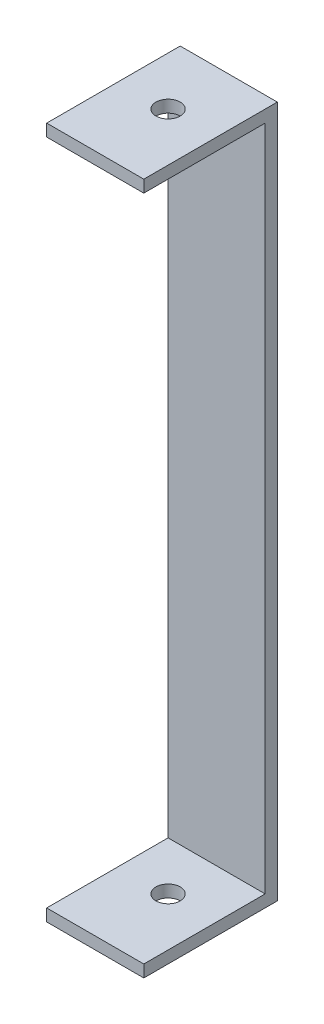
ISO-10303-21;
HEADER;
FILE_DESCRIPTION(('STEP AP214'),'2;1');
FILE_NAME('part.step','',(''),(''),'','','');
FILE_SCHEMA(('AUTOMOTIVE_DESIGN { 1 0 10303 214 1 1 1 1 }'));
ENDSEC;
DATA;
#1=APPLICATION_CONTEXT('core data for automotive mechanical design processes');
#2=APPLICATION_PROTOCOL_DEFINITION('international standard','automotive_design',2000,#1);
#3=PRODUCT_CONTEXT('',#1,'mechanical');
#4=PRODUCT('Part','Part','',(#3));
#5=PRODUCT_RELATED_PRODUCT_CATEGORY('part','',(#4));
#6=PRODUCT_DEFINITION_FORMATION('','',#4);
#7=PRODUCT_DEFINITION_CONTEXT('part definition',#1,'design');
#8=PRODUCT_DEFINITION('design','',#6,#7);
#9=PRODUCT_DEFINITION_SHAPE('','',#8);
#10=(LENGTH_UNIT() NAMED_UNIT(*) SI_UNIT(.MILLI.,.METRE.));
#11=(NAMED_UNIT(*) PLANE_ANGLE_UNIT() SI_UNIT($,.RADIAN.));
#12=(NAMED_UNIT(*) SI_UNIT($,.STERADIAN.) SOLID_ANGLE_UNIT());
#13=UNCERTAINTY_MEASURE_WITH_UNIT(LENGTH_MEASURE(1.E-05),#10,'distance_accuracy_value','');
#14=(GEOMETRIC_REPRESENTATION_CONTEXT(3) GLOBAL_UNCERTAINTY_ASSIGNED_CONTEXT((#13)) GLOBAL_UNIT_ASSIGNED_CONTEXT((#10,
#11,#12)) REPRESENTATION_CONTEXT('',''));
#15=CARTESIAN_POINT('',(0.,0.,0.));
#16=DIRECTION('',(0.,0.,1.));
#17=DIRECTION('',(1.,0.,0.));
#18=AXIS2_PLACEMENT_3D('',#15,#16,#17);
#19=CARTESIAN_POINT('',(0.,0.,2.));
#20=DIRECTION('',(0.,0.,-1.));
#21=DIRECTION('',(-1.,0.,0.));
#22=AXIS2_PLACEMENT_3D('',#19,#20,#21);
#23=PLANE('',#22);
#24=DIRECTION('',(-1.,0.,0.));
#25=VECTOR('',#24,1.);
#26=CARTESIAN_POINT('',(16.3404255319149,2.17021276595745,2.));
#27=LINE('',#26,#25);
#28=CARTESIAN_POINT('',(16.3404255319149,2.17021276595745,2.));
#29=VERTEX_POINT('',#28);
#30=CARTESIAN_POINT('',(0.340425531914913,2.17021276595744,2.));
#31=VERTEX_POINT('',#30);
#32=EDGE_CURVE('E117',#29,#31,#27,.T.);
#33=ORIENTED_EDGE('',*,*,#32,.F.);
#34=DIRECTION('',(0.,1.,0.));
#35=VECTOR('',#34,1.);
#36=CARTESIAN_POINT('',(16.3404255319149,0.170212765957445,2.));
#37=LINE('',#36,#35);
#38=CARTESIAN_POINT('',(16.3404255319149,112.170212765957,2.));
#39=VERTEX_POINT('',#38);
#40=EDGE_CURVE('E121',#29,#39,#37,.T.);
#41=ORIENTED_EDGE('',*,*,#40,.T.);
#42=DIRECTION('',(1.,0.,0.));
#43=VECTOR('',#42,1.);
#44=CARTESIAN_POINT('',(16.3404255319149,112.170212765957,2.));
#45=LINE('',#44,#43);
#46=CARTESIAN_POINT('',(0.340425531914913,112.170212765957,2.));
#47=VERTEX_POINT('',#46);
#48=EDGE_CURVE('E53',#47,#39,#45,.T.);
#49=ORIENTED_EDGE('',*,*,#48,.F.);
#50=DIRECTION('',(0.,-1.,0.));
#51=VECTOR('',#50,1.);
#52=CARTESIAN_POINT('',(0.340425531914913,0.170212765957445,2.));
#53=LINE('',#52,#51);
#54=EDGE_CURVE('E48',#47,#31,#53,.T.);
#55=ORIENTED_EDGE('',*,*,#54,.T.);
#56=EDGE_LOOP('',(#33,#41,#49,#55));
#57=FACE_BOUND('',#56,.T.);
#58=ADVANCED_FACE('F32',(#57),#23,.F.);
#59=CARTESIAN_POINT('',(0.340425531914913,0.170212765957445,2.));
#60=DIRECTION('',(1.,0.,0.));
#61=DIRECTION('',(0.,0.,-1.));
#62=AXIS2_PLACEMENT_3D('',#59,#60,#61);
#63=PLANE('',#62);
#64=DIRECTION('',(0.,-1.,0.));
#65=VECTOR('',#64,1.);
#66=CARTESIAN_POINT('',(0.340425531914913,0.170212765957445,0.));
#67=LINE('',#66,#65);
#68=CARTESIAN_POINT('',(0.340425531914913,114.170212765957,0.));
#69=VERTEX_POINT('',#68);
#70=CARTESIAN_POINT('',(0.340425531914913,0.170212765957445,0.));
#71=VERTEX_POINT('',#70);
#72=EDGE_CURVE('E142',#69,#71,#67,.T.);
#73=ORIENTED_EDGE('',*,*,#72,.T.);
#74=DIRECTION('',(0.,0.,-1.));
#75=VECTOR('',#74,1.);
#76=CARTESIAN_POINT('',(0.340425531914913,0.170212765957445,2.));
#77=LINE('',#76,#75);
#78=CARTESIAN_POINT('',(0.340425531914913,0.170212765957443,22.));
#79=VERTEX_POINT('',#78);
#80=EDGE_CURVE('E11',#79,#71,#77,.T.);
#81=ORIENTED_EDGE('',*,*,#80,.F.);
#82=DIRECTION('',(0.,-1.,0.));
#83=VECTOR('',#82,1.);
#84=CARTESIAN_POINT('',(0.340425531914913,2.17021276595744,22.));
#85=LINE('',#84,#83);
#86=CARTESIAN_POINT('',(0.340425531914913,2.17021276595744,22.));
#87=VERTEX_POINT('',#86);
#88=EDGE_CURVE('E107',#87,#79,#85,.T.);
#89=ORIENTED_EDGE('',*,*,#88,.F.);
#90=DIRECTION('',(0.,0.,-1.));
#91=VECTOR('',#90,1.);
#92=CARTESIAN_POINT('',(0.340425531914913,2.17021276595744,22.));
#93=LINE('',#92,#91);
#94=EDGE_CURVE('E103',#87,#31,#93,.T.);
#95=ORIENTED_EDGE('',*,*,#94,.T.);
#96=ORIENTED_EDGE('',*,*,#54,.F.);
#97=DIRECTION('',(0.,0.,-1.));
#98=VECTOR('',#97,1.);
#99=CARTESIAN_POINT('',(0.340425531914913,112.170212765957,22.));
#100=LINE('',#99,#98);
#101=CARTESIAN_POINT('',(0.340425531914913,112.170212765957,22.));
#102=VERTEX_POINT('',#101);
#103=EDGE_CURVE('E139',#102,#47,#100,.T.);
#104=ORIENTED_EDGE('',*,*,#103,.F.);
#105=DIRECTION('',(0.,-1.,0.));
#106=VECTOR('',#105,1.);
#107=CARTESIAN_POINT('',(0.340425531914913,114.170212765957,22.));
#108=LINE('',#107,#106);
#109=CARTESIAN_POINT('',(0.340425531914913,114.170212765957,22.));
#110=VERTEX_POINT('',#109);
#111=EDGE_CURVE('E133',#110,#102,#108,.T.);
#112=ORIENTED_EDGE('',*,*,#111,.F.);
#113=DIRECTION('',(0.,0.,-1.));
#114=VECTOR('',#113,1.);
#115=CARTESIAN_POINT('',(0.340425531914913,114.170212765957,2.));
#116=LINE('',#115,#114);
#117=EDGE_CURVE('E146',#110,#69,#116,.T.);
#118=ORIENTED_EDGE('',*,*,#117,.T.);
#119=EDGE_LOOP('',(#73,#81,#89,#95,#96,#104,#112,#118));
#120=FACE_BOUND('',#119,.T.);
#121=ADVANCED_FACE('F34',(#120),#63,.F.);
#122=CARTESIAN_POINT('',(0.340425531914913,0.170212765957445,2.));
#123=DIRECTION('',(0.,1.,0.));
#124=DIRECTION('',(0.,0.,1.));
#125=AXIS2_PLACEMENT_3D('',#122,#123,#124);
#126=PLANE('',#125);
#127=CARTESIAN_POINT('',(8.34042553191491,0.170212765957439,10.));
#128=DIRECTION('',(0.,1.,0.));
#129=DIRECTION('',(0.,0.,1.));
#130=AXIS2_PLACEMENT_3D('',#127,#128,#129);
#131=CIRCLE('',#130,2.);
#132=CARTESIAN_POINT('',(8.34042553191491,0.170212765957439,12.));
#133=VERTEX_POINT('',#132);
#134=EDGE_CURVE('E205',#133,#133,#131,.T.);
#135=ORIENTED_EDGE('',*,*,#134,.T.);
#136=EDGE_LOOP('',(#135));
#137=FACE_BOUND('',#136,.T.);
#138=DIRECTION('',(1.,0.,0.));
#139=VECTOR('',#138,1.);
#140=CARTESIAN_POINT('',(0.340425531914913,0.170212765957445,0.));
#141=LINE('',#140,#139);
#142=CARTESIAN_POINT('',(16.3404255319149,0.170212765957445,0.));
#143=VERTEX_POINT('',#142);
#144=EDGE_CURVE('E149',#71,#143,#141,.T.);
#145=ORIENTED_EDGE('',*,*,#144,.T.);
#146=DIRECTION('',(0.,0.,-1.));
#147=VECTOR('',#146,1.);
#148=CARTESIAN_POINT('',(16.3404255319149,0.170212765957445,2.));
#149=LINE('',#148,#147);
#150=CARTESIAN_POINT('',(16.3404255319149,0.170212765957445,22.));
#151=VERTEX_POINT('',#150);
#152=EDGE_CURVE('E41',#151,#143,#149,.T.);
#153=ORIENTED_EDGE('',*,*,#152,.F.);
#154=DIRECTION('',(1.,0.,0.));
#155=VECTOR('',#154,1.);
#156=CARTESIAN_POINT('',(16.3404255319149,0.170212765957445,22.));
#157=LINE('',#156,#155);
#158=EDGE_CURVE('E114',#79,#151,#157,.T.);
#159=ORIENTED_EDGE('',*,*,#158,.F.);
#160=ORIENTED_EDGE('',*,*,#80,.T.);
#161=EDGE_LOOP('',(#145,#153,#159,#160));
#162=FACE_BOUND('',#161,.T.);
#163=ADVANCED_FACE('F193',(#137,#162),#126,.F.);
#164=CARTESIAN_POINT('',(16.3404255319149,0.170212765957445,2.));
#165=DIRECTION('',(-1.,0.,0.));
#166=DIRECTION('',(0.,0.,1.));
#167=AXIS2_PLACEMENT_3D('',#164,#165,#166);
#168=PLANE('',#167);
#169=DIRECTION('',(0.,1.,0.));
#170=VECTOR('',#169,1.);
#171=CARTESIAN_POINT('',(16.3404255319149,0.170212765957445,0.));
#172=LINE('',#171,#170);
#173=CARTESIAN_POINT('',(16.3404255319149,114.170212765957,0.));
#174=VERTEX_POINT('',#173);
#175=EDGE_CURVE('E151',#143,#174,#172,.T.);
#176=ORIENTED_EDGE('',*,*,#175,.T.);
#177=DIRECTION('',(0.,0.,-1.));
#178=VECTOR('',#177,1.);
#179=CARTESIAN_POINT('',(16.3404255319149,114.170212765957,2.));
#180=LINE('',#179,#178);
#181=CARTESIAN_POINT('',(16.3404255319149,114.170212765957,22.));
#182=VERTEX_POINT('',#181);
#183=EDGE_CURVE('E156',#182,#174,#180,.T.);
#184=ORIENTED_EDGE('',*,*,#183,.F.);
#185=DIRECTION('',(0.,1.,0.));
#186=VECTOR('',#185,1.);
#187=CARTESIAN_POINT('',(16.3404255319149,114.170212765957,22.));
#188=LINE('',#187,#186);
#189=CARTESIAN_POINT('',(16.3404255319149,112.170212765957,22.));
#190=VERTEX_POINT('',#189);
#191=EDGE_CURVE('E123',#190,#182,#188,.T.);
#192=ORIENTED_EDGE('',*,*,#191,.F.);
#193=DIRECTION('',(0.,0.,-1.));
#194=VECTOR('',#193,1.);
#195=CARTESIAN_POINT('',(16.3404255319149,112.170212765957,22.));
#196=LINE('',#195,#194);
#197=EDGE_CURVE('E136',#190,#39,#196,.T.);
#198=ORIENTED_EDGE('',*,*,#197,.T.);
#199=ORIENTED_EDGE('',*,*,#40,.F.);
#200=DIRECTION('',(0.,0.,-1.));
#201=VECTOR('',#200,1.);
#202=CARTESIAN_POINT('',(16.3404255319149,2.17021276595745,22.));
#203=LINE('',#202,#201);
#204=CARTESIAN_POINT('',(16.3404255319149,2.17021276595745,22.));
#205=VERTEX_POINT('',#204);
#206=EDGE_CURVE('E101',#205,#29,#203,.T.);
#207=ORIENTED_EDGE('',*,*,#206,.F.);
#208=DIRECTION('',(0.,1.,0.));
#209=VECTOR('',#208,1.);
#210=CARTESIAN_POINT('',(16.3404255319149,2.17021276595745,22.));
#211=LINE('',#210,#209);
#212=EDGE_CURVE('E108',#151,#205,#211,.T.);
#213=ORIENTED_EDGE('',*,*,#212,.F.);
#214=ORIENTED_EDGE('',*,*,#152,.T.);
#215=EDGE_LOOP('',(#176,#184,#192,#198,#199,#207,#213,#214));
#216=FACE_BOUND('',#215,.T.);
#217=ADVANCED_FACE('F119',(#216),#168,.F.);
#218=CARTESIAN_POINT('',(0.340425531914913,114.170212765957,2.));
#219=DIRECTION('',(0.,-1.,0.));
#220=DIRECTION('',(0.,0.,-1.));
#221=AXIS2_PLACEMENT_3D('',#218,#219,#220);
#222=PLANE('',#221);
#223=CARTESIAN_POINT('',(8.34042553191491,114.170212765957,10.));
#224=DIRECTION('',(0.,1.,0.));
#225=DIRECTION('',(0.,0.,1.));
#226=AXIS2_PLACEMENT_3D('',#223,#224,#225);
#227=CIRCLE('',#226,2.);
#228=CARTESIAN_POINT('',(8.34042553191491,114.170212765957,12.));
#229=VERTEX_POINT('',#228);
#230=EDGE_CURVE('E213',#229,#229,#227,.T.);
#231=ORIENTED_EDGE('',*,*,#230,.F.);
#232=EDGE_LOOP('',(#231));
#233=FACE_BOUND('',#232,.T.);
#234=DIRECTION('',(-1.,0.,0.));
#235=VECTOR('',#234,1.);
#236=CARTESIAN_POINT('',(0.340425531914913,114.170212765957,0.));
#237=LINE('',#236,#235);
#238=EDGE_CURVE('E144',#174,#69,#237,.T.);
#239=ORIENTED_EDGE('',*,*,#238,.T.);
#240=ORIENTED_EDGE('',*,*,#117,.F.);
#241=DIRECTION('',(-1.,0.,0.));
#242=VECTOR('',#241,1.);
#243=CARTESIAN_POINT('',(16.3404255319149,114.170212765957,22.));
#244=LINE('',#243,#242);
#245=EDGE_CURVE('E130',#182,#110,#244,.T.);
#246=ORIENTED_EDGE('',*,*,#245,.F.);
#247=ORIENTED_EDGE('',*,*,#183,.T.);
#248=EDGE_LOOP('',(#239,#240,#246,#247));
#249=FACE_BOUND('',#248,.T.);
#250=ADVANCED_FACE('F166',(#233,#249),#222,.F.);
#251=CARTESIAN_POINT('',(0.,0.,0.));
#252=DIRECTION('',(0.,0.,-1.));
#253=DIRECTION('',(-1.,0.,0.));
#254=AXIS2_PLACEMENT_3D('',#251,#252,#253);
#255=PLANE('',#254);
#256=ORIENTED_EDGE('',*,*,#72,.F.);
#257=ORIENTED_EDGE('',*,*,#238,.F.);
#258=ORIENTED_EDGE('',*,*,#175,.F.);
#259=ORIENTED_EDGE('',*,*,#144,.F.);
#260=EDGE_LOOP('',(#256,#257,#258,#259));
#261=FACE_BOUND('',#260,.T.);
#262=ADVANCED_FACE('F164',(#261),#255,.T.);
#263=CARTESIAN_POINT('',(16.3404255319149,112.170212765957,22.));
#264=DIRECTION('',(0.,1.,0.));
#265=DIRECTION('',(0.,0.,1.));
#266=AXIS2_PLACEMENT_3D('',#263,#264,#265);
#267=PLANE('',#266);
#268=CARTESIAN_POINT('',(8.34042553191491,112.170212765957,10.));
#269=DIRECTION('',(0.,1.,0.));
#270=DIRECTION('',(0.,0.,1.));
#271=AXIS2_PLACEMENT_3D('',#268,#269,#270);
#272=CIRCLE('',#271,2.);
#273=CARTESIAN_POINT('',(8.34042553191491,112.170212765957,12.));
#274=VERTEX_POINT('',#273);
#275=EDGE_CURVE('E208',#274,#274,#272,.T.);
#276=ORIENTED_EDGE('',*,*,#275,.T.);
#277=EDGE_LOOP('',(#276));
#278=FACE_BOUND('',#277,.T.);
#279=ORIENTED_EDGE('',*,*,#48,.T.);
#280=ORIENTED_EDGE('',*,*,#197,.F.);
#281=DIRECTION('',(1.,0.,0.));
#282=VECTOR('',#281,1.);
#283=CARTESIAN_POINT('',(16.3404255319149,112.170212765957,22.));
#284=LINE('',#283,#282);
#285=EDGE_CURVE('E135',#102,#190,#284,.T.);
#286=ORIENTED_EDGE('',*,*,#285,.F.);
#287=ORIENTED_EDGE('',*,*,#103,.T.);
#288=EDGE_LOOP('',(#279,#280,#286,#287));
#289=FACE_BOUND('',#288,.T.);
#290=ADVANCED_FACE('F177',(#278,#289),#267,.F.);
#291=CARTESIAN_POINT('',(0.,0.,22.));
#292=DIRECTION('',(0.,0.,-1.));
#293=DIRECTION('',(-1.,0.,0.));
#294=AXIS2_PLACEMENT_3D('',#291,#292,#293);
#295=PLANE('',#294);
#296=ORIENTED_EDGE('',*,*,#191,.T.);
#297=ORIENTED_EDGE('',*,*,#245,.T.);
#298=ORIENTED_EDGE('',*,*,#111,.T.);
#299=ORIENTED_EDGE('',*,*,#285,.T.);
#300=EDGE_LOOP('',(#296,#297,#298,#299));
#301=FACE_BOUND('',#300,.T.);
#302=ADVANCED_FACE('F173',(#301),#295,.F.);
#303=CARTESIAN_POINT('',(16.3404255319149,2.17021276595745,22.));
#304=DIRECTION('',(0.,-1.,0.));
#305=DIRECTION('',(1.,0.,0.));
#306=AXIS2_PLACEMENT_3D('',#303,#304,#305);
#307=PLANE('',#306);
#308=CARTESIAN_POINT('',(8.34042553191491,2.17021276595744,10.));
#309=DIRECTION('',(0.,-1.,0.));
#310=DIRECTION('',(1.,0.,0.));
#311=AXIS2_PLACEMENT_3D('',#308,#309,#310);
#312=CIRCLE('',#311,2.);
#313=CARTESIAN_POINT('',(8.34042553191491,2.17021276595744,12.));
#314=VERTEX_POINT('',#313);
#315=EDGE_CURVE('E36',#314,#314,#312,.T.);
#316=ORIENTED_EDGE('',*,*,#315,.T.);
#317=EDGE_LOOP('',(#316));
#318=FACE_BOUND('',#317,.T.);
#319=ORIENTED_EDGE('',*,*,#32,.T.);
#320=ORIENTED_EDGE('',*,*,#94,.F.);
#321=DIRECTION('',(-1.,0.,0.));
#322=VECTOR('',#321,1.);
#323=CARTESIAN_POINT('',(16.3404255319149,2.17021276595745,22.));
#324=LINE('',#323,#322);
#325=EDGE_CURVE('E97',#205,#87,#324,.T.);
#326=ORIENTED_EDGE('',*,*,#325,.F.);
#327=ORIENTED_EDGE('',*,*,#206,.T.);
#328=EDGE_LOOP('',(#319,#320,#326,#327));
#329=FACE_BOUND('',#328,.T.);
#330=ADVANCED_FACE('F99',(#318,#329),#307,.F.);
#331=CARTESIAN_POINT('',(0.,0.,22.));
#332=DIRECTION('',(0.,0.,-1.));
#333=DIRECTION('',(-1.,0.,0.));
#334=AXIS2_PLACEMENT_3D('',#331,#332,#333);
#335=PLANE('',#334);
#336=ORIENTED_EDGE('',*,*,#212,.T.);
#337=ORIENTED_EDGE('',*,*,#325,.T.);
#338=ORIENTED_EDGE('',*,*,#88,.T.);
#339=ORIENTED_EDGE('',*,*,#158,.T.);
#340=EDGE_LOOP('',(#336,#337,#338,#339));
#341=FACE_BOUND('',#340,.T.);
#342=ADVANCED_FACE('F112',(#341),#335,.F.);
#343=CARTESIAN_POINT('',(8.34042553191491,0.170212765957439,10.));
#344=DIRECTION('',(0.,1.,0.));
#345=DIRECTION('',(0.,0.,1.));
#346=AXIS2_PLACEMENT_3D('',#343,#344,#345);
#347=CYLINDRICAL_SURFACE('',#346,2.);
#348=CARTESIAN_POINT('',(8.34042553191491,0.170212765957439,12.));
#349=CARTESIAN_POINT('',(8.34042553191491,0.191046099290773,12.));
#350=CARTESIAN_POINT('',(8.34042553191491,0.211879432624106,12.));
#351=CARTESIAN_POINT('',(8.34042553191491,0.253546099290773,12.));
#352=CARTESIAN_POINT('',(8.34042553191491,0.274379432624106,12.));
#353=CARTESIAN_POINT('',(8.34042553191491,0.316046099290773,12.));
#354=CARTESIAN_POINT('',(8.34042553191491,0.336879432624106,12.));
#355=CARTESIAN_POINT('',(8.34042553191491,0.378546099290773,12.));
#356=CARTESIAN_POINT('',(8.34042553191491,0.399379432624106,12.));
#357=CARTESIAN_POINT('',(8.34042553191491,0.441046099290773,12.));
#358=CARTESIAN_POINT('',(8.34042553191491,0.461879432624106,12.));
#359=CARTESIAN_POINT('',(8.34042553191491,0.503546099290773,12.));
#360=CARTESIAN_POINT('',(8.34042553191491,0.524379432624106,12.));
#361=CARTESIAN_POINT('',(8.34042553191491,0.566046099290773,12.));
#362=CARTESIAN_POINT('',(8.34042553191491,0.586879432624106,12.));
#363=CARTESIAN_POINT('',(8.34042553191491,0.628546099290773,12.));
#364=CARTESIAN_POINT('',(8.34042553191491,0.649379432624106,12.));
#365=CARTESIAN_POINT('',(8.34042553191491,0.691046099290773,12.));
#366=CARTESIAN_POINT('',(8.34042553191491,0.711879432624107,12.));
#367=CARTESIAN_POINT('',(8.34042553191491,0.753546099290773,12.));
#368=CARTESIAN_POINT('',(8.34042553191491,0.774379432624107,12.));
#369=CARTESIAN_POINT('',(8.34042553191491,0.816046099290773,12.));
#370=CARTESIAN_POINT('',(8.34042553191491,0.836879432624107,12.));
#371=CARTESIAN_POINT('',(8.34042553191491,0.878546099290773,12.));
#372=CARTESIAN_POINT('',(8.34042553191491,0.899379432624107,12.));
#373=CARTESIAN_POINT('',(8.34042553191491,0.941046099290773,12.));
#374=CARTESIAN_POINT('',(8.34042553191491,0.961879432624107,12.));
#375=CARTESIAN_POINT('',(8.34042553191491,1.00354609929077,12.));
#376=CARTESIAN_POINT('',(8.34042553191491,1.02437943262411,12.));
#377=CARTESIAN_POINT('',(8.34042553191491,1.06604609929077,12.));
#378=CARTESIAN_POINT('',(8.34042553191491,1.08687943262411,12.));
#379=CARTESIAN_POINT('',(8.34042553191491,1.12854609929077,12.));
#380=CARTESIAN_POINT('',(8.34042553191491,1.14937943262411,12.));
#381=CARTESIAN_POINT('',(8.34042553191491,1.19104609929077,12.));
#382=CARTESIAN_POINT('',(8.34042553191491,1.21187943262411,12.));
#383=CARTESIAN_POINT('',(8.34042553191491,1.25354609929077,12.));
#384=CARTESIAN_POINT('',(8.34042553191491,1.27437943262411,12.));
#385=CARTESIAN_POINT('',(8.34042553191491,1.31604609929077,12.));
#386=CARTESIAN_POINT('',(8.34042553191491,1.33687943262411,12.));
#387=CARTESIAN_POINT('',(8.34042553191491,1.37854609929077,12.));
#388=CARTESIAN_POINT('',(8.34042553191491,1.39937943262411,12.));
#389=CARTESIAN_POINT('',(8.34042553191491,1.44104609929077,12.));
#390=CARTESIAN_POINT('',(8.34042553191491,1.46187943262411,12.));
#391=CARTESIAN_POINT('',(8.34042553191491,1.50354609929077,12.));
#392=CARTESIAN_POINT('',(8.34042553191491,1.52437943262411,12.));
#393=CARTESIAN_POINT('',(8.34042553191491,1.56604609929077,12.));
#394=CARTESIAN_POINT('',(8.34042553191491,1.58687943262411,12.));
#395=CARTESIAN_POINT('',(8.34042553191491,1.62854609929077,12.));
#396=CARTESIAN_POINT('',(8.34042553191491,1.64937943262411,12.));
#397=CARTESIAN_POINT('',(8.34042553191491,1.69104609929077,12.));
#398=CARTESIAN_POINT('',(8.34042553191491,1.71187943262411,12.));
#399=CARTESIAN_POINT('',(8.34042553191491,1.75354609929077,12.));
#400=CARTESIAN_POINT('',(8.34042553191491,1.77437943262411,12.));
#401=CARTESIAN_POINT('',(8.34042553191491,1.81604609929077,12.));
#402=CARTESIAN_POINT('',(8.34042553191491,1.83687943262411,12.));
#403=CARTESIAN_POINT('',(8.34042553191491,1.87854609929077,12.));
#404=CARTESIAN_POINT('',(8.34042553191491,1.89937943262411,12.));
#405=CARTESIAN_POINT('',(8.34042553191491,1.94104609929077,12.));
#406=CARTESIAN_POINT('',(8.34042553191491,1.96187943262411,12.));
#407=CARTESIAN_POINT('',(8.34042553191491,2.00354609929077,12.));
#408=CARTESIAN_POINT('',(8.34042553191491,2.02437943262411,12.));
#409=CARTESIAN_POINT('',(8.34042553191491,2.06604609929078,12.));
#410=CARTESIAN_POINT('',(8.34042553191491,2.08687943262411,12.));
#411=CARTESIAN_POINT('',(8.34042553191491,2.12854609929078,12.));
#412=CARTESIAN_POINT('',(8.34042553191491,2.14937943262411,12.));
#413=CARTESIAN_POINT('',(8.34042553191491,2.17021276595744,12.));
#414=B_SPLINE_CURVE_WITH_KNOTS('',3,(#348,#349,#350,#351,#352,#353,#354,#355,#356,#357,#358,
#359,#360,#361,#362,#363,#364,#365,#366,#367,#368,#369,#370,#371,#372,#373,#374,#375,#376,#377,
#378,#379,#380,#381,#382,#383,#384,#385,#386,#387,#388,#389,#390,#391,#392,#393,#394,#395,#396,
#397,#398,#399,#400,#401,#402,#403,#404,#405,#406,#407,#408,#409,#410,#411,#412,#413),
.UNSPECIFIED.,.F.,.F.,(4,2,2,2,2,2,2,2,2,2,2,2,2,2,2,2,2,2,2,2,2,2,2,2,2,2,2,2,2,2,2,2,4),(0.,
0.0625000000000001,0.125,0.1875,0.25,0.3125,0.375,0.437500000000001,0.500000000000001,
0.562500000000001,0.625000000000001,0.687500000000001,0.750000000000001,0.812500000000001,
0.875000000000001,0.937500000000001,1.,1.0625,1.125,1.1875,1.25,1.3125,1.375,1.4375,1.5,1.5625,
1.625,1.6875,1.75,1.8125,1.875,1.9375,2.),.UNSPECIFIED.);
#415=EDGE_CURVE('BSEAM221',#133,#314,#414,.T.);
#416=ORIENTED_EDGE('',*,*,#134,.F.);
#417=ORIENTED_EDGE('',*,*,#315,.F.);
#418=ORIENTED_EDGE('',*,*,#415,.T.);
#419=ORIENTED_EDGE('',*,*,#415,.F.);
#420=EDGE_LOOP('',(#416,#418,#417,#419));
#421=FACE_BOUND('',#420,.T.);
#422=ADVANCED_FACE('F221',(#421),#347,.F.);
#423=CARTESIAN_POINT('',(8.34042553191491,114.170212765957,12.));
#424=CARTESIAN_POINT('',(8.34042553191491,114.149379432624,12.));
#425=CARTESIAN_POINT('',(8.34042553191491,114.128546099291,12.));
#426=CARTESIAN_POINT('',(8.34042553191491,114.086879432624,12.));
#427=CARTESIAN_POINT('',(8.34042553191491,114.066046099291,12.));
#428=CARTESIAN_POINT('',(8.34042553191491,114.024379432624,12.));
#429=CARTESIAN_POINT('',(8.34042553191491,114.003546099291,12.));
#430=CARTESIAN_POINT('',(8.34042553191491,113.961879432624,12.));
#431=CARTESIAN_POINT('',(8.34042553191491,113.941046099291,12.));
#432=CARTESIAN_POINT('',(8.34042553191491,113.899379432624,12.));
#433=CARTESIAN_POINT('',(8.34042553191491,113.878546099291,12.));
#434=CARTESIAN_POINT('',(8.34042553191491,113.836879432624,12.));
#435=CARTESIAN_POINT('',(8.34042553191491,113.816046099291,12.));
#436=CARTESIAN_POINT('',(8.34042553191491,113.774379432624,12.));
#437=CARTESIAN_POINT('',(8.34042553191491,113.753546099291,12.));
#438=CARTESIAN_POINT('',(8.34042553191491,113.711879432624,12.));
#439=CARTESIAN_POINT('',(8.34042553191491,113.691046099291,12.));
#440=CARTESIAN_POINT('',(8.34042553191491,113.649379432624,12.));
#441=CARTESIAN_POINT('',(8.34042553191491,113.628546099291,12.));
#442=CARTESIAN_POINT('',(8.34042553191491,113.586879432624,12.));
#443=CARTESIAN_POINT('',(8.34042553191491,113.566046099291,12.));
#444=CARTESIAN_POINT('',(8.34042553191491,113.524379432624,12.));
#445=CARTESIAN_POINT('',(8.34042553191491,113.503546099291,12.));
#446=CARTESIAN_POINT('',(8.34042553191491,113.461879432624,12.));
#447=CARTESIAN_POINT('',(8.34042553191491,113.441046099291,12.));
#448=CARTESIAN_POINT('',(8.34042553191491,113.399379432624,12.));
#449=CARTESIAN_POINT('',(8.34042553191491,113.378546099291,12.));
#450=CARTESIAN_POINT('',(8.34042553191491,113.336879432624,12.));
#451=CARTESIAN_POINT('',(8.34042553191491,113.316046099291,12.));
#452=CARTESIAN_POINT('',(8.34042553191491,113.274379432624,12.));
#453=CARTESIAN_POINT('',(8.34042553191491,113.253546099291,12.));
#454=CARTESIAN_POINT('',(8.34042553191491,113.211879432624,12.));
#455=CARTESIAN_POINT('',(8.34042553191491,113.191046099291,12.));
#456=CARTESIAN_POINT('',(8.34042553191491,113.149379432624,12.));
#457=CARTESIAN_POINT('',(8.34042553191491,113.128546099291,12.));
#458=CARTESIAN_POINT('',(8.34042553191491,113.086879432624,12.));
#459=CARTESIAN_POINT('',(8.34042553191491,113.066046099291,12.));
#460=CARTESIAN_POINT('',(8.34042553191491,113.024379432624,12.));
#461=CARTESIAN_POINT('',(8.34042553191491,113.003546099291,12.));
#462=CARTESIAN_POINT('',(8.34042553191491,112.961879432624,12.));
#463=CARTESIAN_POINT('',(8.34042553191491,112.941046099291,12.));
#464=CARTESIAN_POINT('',(8.34042553191491,112.899379432624,12.));
#465=CARTESIAN_POINT('',(8.34042553191491,112.878546099291,12.));
#466=CARTESIAN_POINT('',(8.34042553191491,112.836879432624,12.));
#467=CARTESIAN_POINT('',(8.34042553191491,112.816046099291,12.));
#468=CARTESIAN_POINT('',(8.34042553191491,112.774379432624,12.));
#469=CARTESIAN_POINT('',(8.34042553191491,112.753546099291,12.));
#470=CARTESIAN_POINT('',(8.34042553191491,112.711879432624,12.));
#471=CARTESIAN_POINT('',(8.34042553191491,112.691046099291,12.));
#472=CARTESIAN_POINT('',(8.34042553191491,112.649379432624,12.));
#473=CARTESIAN_POINT('',(8.34042553191491,112.628546099291,12.));
#474=CARTESIAN_POINT('',(8.34042553191491,112.586879432624,12.));
#475=CARTESIAN_POINT('',(8.34042553191491,112.566046099291,12.));
#476=CARTESIAN_POINT('',(8.34042553191491,112.524379432624,12.));
#477=CARTESIAN_POINT('',(8.34042553191491,112.503546099291,12.));
#478=CARTESIAN_POINT('',(8.34042553191491,112.461879432624,12.));
#479=CARTESIAN_POINT('',(8.34042553191491,112.441046099291,12.));
#480=CARTESIAN_POINT('',(8.34042553191491,112.399379432624,12.));
#481=CARTESIAN_POINT('',(8.34042553191491,112.378546099291,12.));
#482=CARTESIAN_POINT('',(8.34042553191491,112.336879432624,12.));
#483=CARTESIAN_POINT('',(8.34042553191491,112.316046099291,12.));
#484=CARTESIAN_POINT('',(8.34042553191491,112.274379432624,12.));
#485=CARTESIAN_POINT('',(8.34042553191491,112.253546099291,12.));
#486=CARTESIAN_POINT('',(8.34042553191491,112.211879432624,12.));
#487=CARTESIAN_POINT('',(8.34042553191491,112.191046099291,12.));
#488=CARTESIAN_POINT('',(8.34042553191491,112.170212765957,12.));
#489=B_SPLINE_CURVE_WITH_KNOTS('',3,(#423,#424,#425,#426,#427,#428,#429,#430,#431,#432,#433,
#434,#435,#436,#437,#438,#439,#440,#441,#442,#443,#444,#445,#446,#447,#448,#449,#450,#451,#452,
#453,#454,#455,#456,#457,#458,#459,#460,#461,#462,#463,#464,#465,#466,#467,#468,#469,#470,#471,
#472,#473,#474,#475,#476,#477,#478,#479,#480,#481,#482,#483,#484,#485,#486,#487,#488),
.UNSPECIFIED.,.F.,.F.,(4,2,2,2,2,2,2,2,2,2,2,2,2,2,2,2,2,2,2,2,2,2,2,2,2,2,2,2,2,2,2,2,4),(0.,
0.0624999999999931,0.125,0.187500000000007,0.25,0.312499999999993,0.375,0.437500000000007,0.5,
0.562499999999994,0.625000000000001,0.687500000000008,0.750000000000001,0.812499999999994,
0.875000000000001,0.937500000000008,1.,1.06249999999999,1.125,1.18750000000001,1.25,
1.31249999999999,1.375,1.43750000000001,1.5,1.56249999999999,1.625,1.68750000000001,1.75,
1.81249999999999,1.875,1.93750000000001,2.),.UNSPECIFIED.);
#490=EDGE_CURVE('BSEAM218',#229,#274,#489,.T.);
#491=ORIENTED_EDGE('',*,*,#230,.T.);
#492=ORIENTED_EDGE('',*,*,#275,.F.);
#493=ORIENTED_EDGE('',*,*,#490,.T.);
#494=ORIENTED_EDGE('',*,*,#490,.F.);
#495=EDGE_LOOP('',(#491,#493,#492,#494));
#496=FACE_BOUND('',#495,.T.);
#497=ADVANCED_FACE('F218',(#496),#347,.F.);
#498=CLOSED_SHELL('',(#58,#121,#163,#217,#250,#262,#290,#302,#330,#342,#422,#497));
#499=MANIFOLD_SOLID_BREP('B2',#498);
#500=ADVANCED_BREP_SHAPE_REPRESENTATION('',(#18,#499),#14);
#501=SHAPE_DEFINITION_REPRESENTATION(#9,#500);
ENDSEC;
END-ISO-10303-21;
